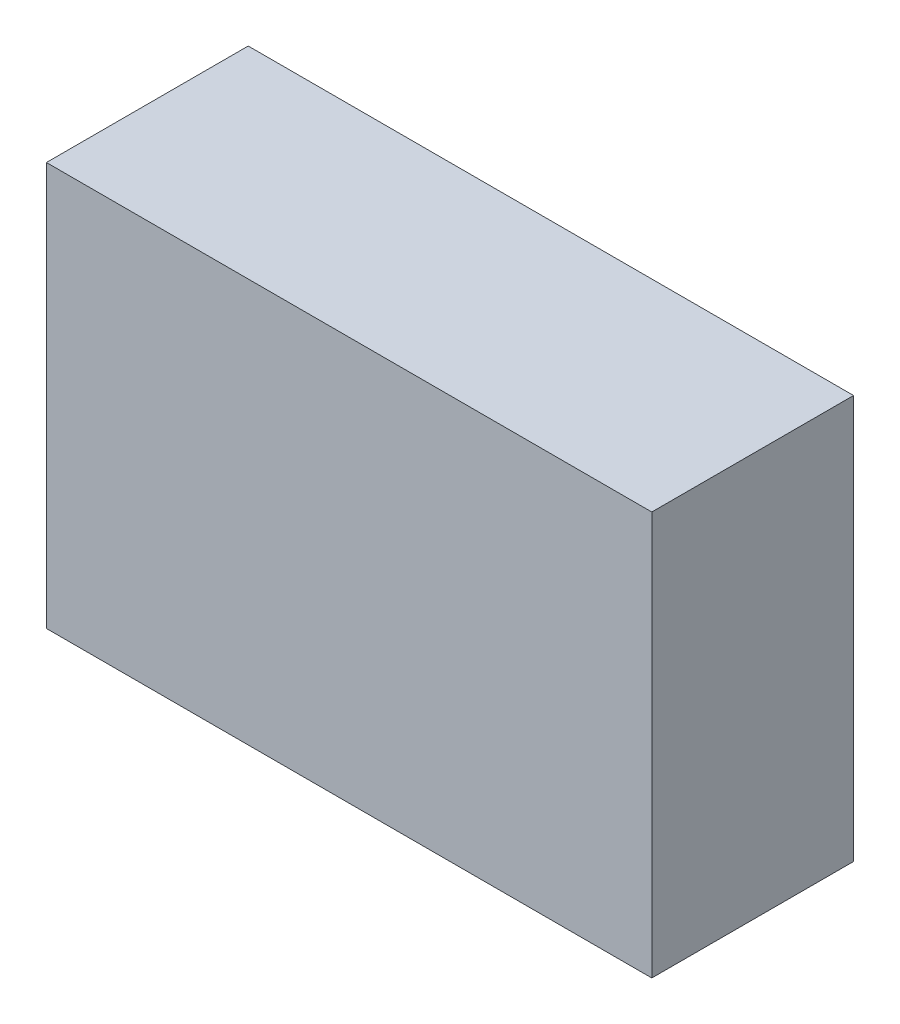
ISO-10303-21;
HEADER;
FILE_DESCRIPTION(('STEP AP214'),'2;1');
FILE_NAME('part.step','',(''),(''),'','','');
FILE_SCHEMA(('AUTOMOTIVE_DESIGN { 1 0 10303 214 1 1 1 1 }'));
ENDSEC;
DATA;
#1=APPLICATION_CONTEXT('core data for automotive mechanical design processes');
#2=APPLICATION_PROTOCOL_DEFINITION('international standard','automotive_design',2000,#1);
#3=PRODUCT_CONTEXT('',#1,'mechanical');
#4=PRODUCT('Part','Part','',(#3));
#5=PRODUCT_RELATED_PRODUCT_CATEGORY('part','',(#4));
#6=PRODUCT_DEFINITION_FORMATION('','',#4);
#7=PRODUCT_DEFINITION_CONTEXT('part definition',#1,'design');
#8=PRODUCT_DEFINITION('design','',#6,#7);
#9=PRODUCT_DEFINITION_SHAPE('','',#8);
#10=(LENGTH_UNIT() NAMED_UNIT(*) SI_UNIT(.MILLI.,.METRE.));
#11=(NAMED_UNIT(*) PLANE_ANGLE_UNIT() SI_UNIT($,.RADIAN.));
#12=(NAMED_UNIT(*) SI_UNIT($,.STERADIAN.) SOLID_ANGLE_UNIT());
#13=UNCERTAINTY_MEASURE_WITH_UNIT(LENGTH_MEASURE(1.E-05),#10,'distance_accuracy_value','');
#14=(GEOMETRIC_REPRESENTATION_CONTEXT(3) GLOBAL_UNCERTAINTY_ASSIGNED_CONTEXT((#13)) GLOBAL_UNIT_ASSIGNED_CONTEXT((#10,
#11,#12)) REPRESENTATION_CONTEXT('',''));
#15=CARTESIAN_POINT('',(0.,0.,0.));
#16=DIRECTION('',(0.,0.,1.));
#17=DIRECTION('',(1.,0.,0.));
#18=AXIS2_PLACEMENT_3D('',#15,#16,#17);
#19=CARTESIAN_POINT('',(-51.7921740237691,40.7559422750424,30.));
#20=DIRECTION('',(1.,0.,0.));
#21=DIRECTION('',(0.,0.,-1.));
#22=AXIS2_PLACEMENT_3D('',#19,#20,#21);
#23=PLANE('',#22);
#24=DIRECTION('',(0.,-1.,0.));
#25=VECTOR('',#24,1.);
#26=CARTESIAN_POINT('',(-51.7921740237691,40.7559422750424,0.));
#27=LINE('',#26,#25);
#28=CARTESIAN_POINT('',(-51.7921740237691,40.7559422750424,0.));
#29=VERTEX_POINT('',#28);
#30=CARTESIAN_POINT('',(-51.7921740237691,-19.2440577249576,0.));
#31=VERTEX_POINT('',#30);
#32=EDGE_CURVE('E96',#29,#31,#27,.T.);
#33=ORIENTED_EDGE('',*,*,#32,.T.);
#34=DIRECTION('',(0.,0.,-1.));
#35=VECTOR('',#34,1.);
#36=CARTESIAN_POINT('',(-51.7921740237691,-19.2440577249576,30.));
#37=LINE('',#36,#35);
#38=CARTESIAN_POINT('',(-51.7921740237691,-19.2440577249576,30.));
#39=VERTEX_POINT('',#38);
#40=EDGE_CURVE('E11',#39,#31,#37,.T.);
#41=ORIENTED_EDGE('',*,*,#40,.F.);
#42=DIRECTION('',(0.,-1.,0.));
#43=VECTOR('',#42,1.);
#44=CARTESIAN_POINT('',(-51.7921740237691,40.7559422750424,30.));
#45=LINE('',#44,#43);
#46=CARTESIAN_POINT('',(-51.7921740237691,40.7559422750424,30.));
#47=VERTEX_POINT('',#46);
#48=EDGE_CURVE('E84',#47,#39,#45,.T.);
#49=ORIENTED_EDGE('',*,*,#48,.F.);
#50=DIRECTION('',(0.,0.,-1.));
#51=VECTOR('',#50,1.);
#52=CARTESIAN_POINT('',(-51.7921740237691,40.7559422750424,30.));
#53=LINE('',#52,#51);
#54=EDGE_CURVE('E92',#47,#29,#53,.T.);
#55=ORIENTED_EDGE('',*,*,#54,.T.);
#56=EDGE_LOOP('',(#33,#41,#49,#55));
#57=FACE_BOUND('',#56,.T.);
#58=ADVANCED_FACE('F33',(#57),#23,.F.);
#59=CARTESIAN_POINT('',(-51.7921740237691,-19.2440577249576,30.));
#60=DIRECTION('',(0.,1.,0.));
#61=DIRECTION('',(0.,0.,1.));
#62=AXIS2_PLACEMENT_3D('',#59,#60,#61);
#63=PLANE('',#62);
#64=DIRECTION('',(1.,0.,0.));
#65=VECTOR('',#64,1.);
#66=CARTESIAN_POINT('',(-51.7921740237691,-19.2440577249576,0.));
#67=LINE('',#66,#65);
#68=CARTESIAN_POINT('',(38.2078259762309,-19.2440577249576,0.));
#69=VERTEX_POINT('',#68);
#70=EDGE_CURVE('E88',#31,#69,#67,.T.);
#71=ORIENTED_EDGE('',*,*,#70,.T.);
#72=DIRECTION('',(0.,0.,-1.));
#73=VECTOR('',#72,1.);
#74=CARTESIAN_POINT('',(38.2078259762309,-19.2440577249576,30.));
#75=LINE('',#74,#73);
#76=CARTESIAN_POINT('',(38.2078259762309,-19.2440577249576,30.));
#77=VERTEX_POINT('',#76);
#78=EDGE_CURVE('E41',#77,#69,#75,.T.);
#79=ORIENTED_EDGE('',*,*,#78,.F.);
#80=DIRECTION('',(1.,0.,0.));
#81=VECTOR('',#80,1.);
#82=CARTESIAN_POINT('',(-51.7921740237691,-19.2440577249576,30.));
#83=LINE('',#82,#81);
#84=EDGE_CURVE('E79',#39,#77,#83,.T.);
#85=ORIENTED_EDGE('',*,*,#84,.F.);
#86=ORIENTED_EDGE('',*,*,#40,.T.);
#87=EDGE_LOOP('',(#71,#79,#85,#86));
#88=FACE_BOUND('',#87,.T.);
#89=ADVANCED_FACE('F87',(#88),#63,.F.);
#90=CARTESIAN_POINT('',(38.2078259762309,40.7559422750424,30.));
#91=DIRECTION('',(-1.,0.,0.));
#92=DIRECTION('',(0.,-1.,0.));
#93=AXIS2_PLACEMENT_3D('',#90,#91,#92);
#94=PLANE('',#93);
#95=DIRECTION('',(0.,1.,0.));
#96=VECTOR('',#95,1.);
#97=CARTESIAN_POINT('',(38.2078259762309,40.7559422750424,0.));
#98=LINE('',#97,#96);
#99=CARTESIAN_POINT('',(38.2078259762309,40.7559422750424,0.));
#100=VERTEX_POINT('',#99);
#101=EDGE_CURVE('E66',#69,#100,#98,.T.);
#102=ORIENTED_EDGE('',*,*,#101,.T.);
#103=DIRECTION('',(0.,0.,-1.));
#104=VECTOR('',#103,1.);
#105=CARTESIAN_POINT('',(38.2078259762309,40.7559422750424,30.));
#106=LINE('',#105,#104);
#107=CARTESIAN_POINT('',(38.2078259762309,40.7559422750424,30.));
#108=VERTEX_POINT('',#107);
#109=EDGE_CURVE('E89',#108,#100,#106,.T.);
#110=ORIENTED_EDGE('',*,*,#109,.F.);
#111=DIRECTION('',(0.,1.,0.));
#112=VECTOR('',#111,1.);
#113=CARTESIAN_POINT('',(38.2078259762309,40.7559422750424,30.));
#114=LINE('',#113,#112);
#115=EDGE_CURVE('E82',#77,#108,#114,.T.);
#116=ORIENTED_EDGE('',*,*,#115,.F.);
#117=ORIENTED_EDGE('',*,*,#78,.T.);
#118=EDGE_LOOP('',(#102,#110,#116,#117));
#119=FACE_BOUND('',#118,.T.);
#120=ADVANCED_FACE('F90',(#119),#94,.F.);
#121=CARTESIAN_POINT('',(-51.7921740237691,40.7559422750424,30.));
#122=DIRECTION('',(0.,-1.,0.));
#123=DIRECTION('',(0.,0.,-1.));
#124=AXIS2_PLACEMENT_3D('',#121,#122,#123);
#125=PLANE('',#124);
#126=DIRECTION('',(-1.,0.,0.));
#127=VECTOR('',#126,1.);
#128=CARTESIAN_POINT('',(-51.7921740237691,40.7559422750424,0.));
#129=LINE('',#128,#127);
#130=EDGE_CURVE('E72',#100,#29,#129,.T.);
#131=ORIENTED_EDGE('',*,*,#130,.T.);
#132=ORIENTED_EDGE('',*,*,#54,.F.);
#133=DIRECTION('',(-1.,0.,0.));
#134=VECTOR('',#133,1.);
#135=CARTESIAN_POINT('',(-51.7921740237691,40.7559422750424,30.));
#136=LINE('',#135,#134);
#137=EDGE_CURVE('E49',#108,#47,#136,.T.);
#138=ORIENTED_EDGE('',*,*,#137,.F.);
#139=ORIENTED_EDGE('',*,*,#109,.T.);
#140=EDGE_LOOP('',(#131,#132,#138,#139));
#141=FACE_BOUND('',#140,.T.);
#142=ADVANCED_FACE('F103',(#141),#125,.F.);
#143=CARTESIAN_POINT('',(0.,0.,30.));
#144=DIRECTION('',(0.,0.,1.));
#145=DIRECTION('',(1.,0.,0.));
#146=AXIS2_PLACEMENT_3D('',#143,#144,#145);
#147=PLANE('',#146);
#148=ORIENTED_EDGE('',*,*,#48,.T.);
#149=ORIENTED_EDGE('',*,*,#84,.T.);
#150=ORIENTED_EDGE('',*,*,#115,.T.);
#151=ORIENTED_EDGE('',*,*,#137,.T.);
#152=EDGE_LOOP('',(#148,#149,#150,#151));
#153=FACE_BOUND('',#152,.T.);
#154=ADVANCED_FACE('F80',(#153),#147,.T.);
#155=CARTESIAN_POINT('',(0.,0.,0.));
#156=DIRECTION('',(0.,0.,1.));
#157=DIRECTION('',(1.,0.,0.));
#158=AXIS2_PLACEMENT_3D('',#155,#156,#157);
#159=PLANE('',#158);
#160=ORIENTED_EDGE('',*,*,#32,.F.);
#161=ORIENTED_EDGE('',*,*,#130,.F.);
#162=ORIENTED_EDGE('',*,*,#101,.F.);
#163=ORIENTED_EDGE('',*,*,#70,.F.);
#164=EDGE_LOOP('',(#160,#161,#162,#163));
#165=FACE_BOUND('',#164,.T.);
#166=ADVANCED_FACE('F106',(#165),#159,.F.);
#167=CLOSED_SHELL('',(#58,#89,#120,#142,#154,#166));
#168=MANIFOLD_SOLID_BREP('B2',#167);
#169=ADVANCED_BREP_SHAPE_REPRESENTATION('',(#18,#168),#14);
#170=SHAPE_DEFINITION_REPRESENTATION(#9,#169);
ENDSEC;
END-ISO-10303-21;
